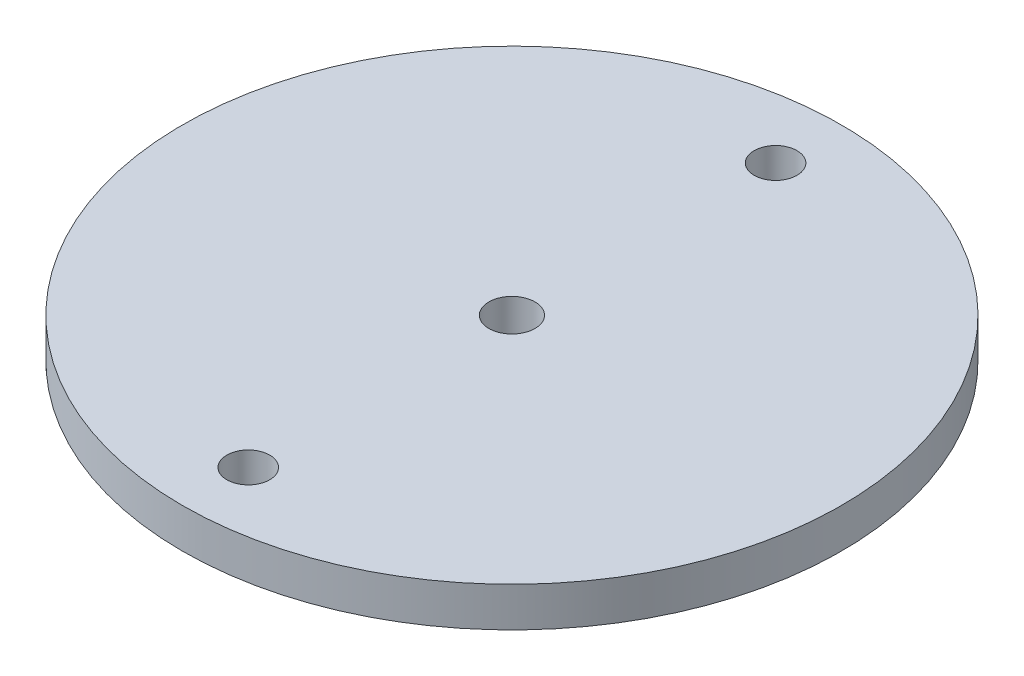
ISO-10303-21;
HEADER;
FILE_DESCRIPTION(('STEP AP214'),'2;1');
FILE_NAME('part.step','',(''),(''),'','','');
FILE_SCHEMA(('AUTOMOTIVE_DESIGN { 1 0 10303 214 1 1 1 1 }'));
ENDSEC;
DATA;
#1=APPLICATION_CONTEXT('core data for automotive mechanical design processes');
#2=APPLICATION_PROTOCOL_DEFINITION('international standard','automotive_design',2000,#1);
#3=PRODUCT_CONTEXT('',#1,'mechanical');
#4=PRODUCT('Part','Part','',(#3));
#5=PRODUCT_RELATED_PRODUCT_CATEGORY('part','',(#4));
#6=PRODUCT_DEFINITION_FORMATION('','',#4);
#7=PRODUCT_DEFINITION_CONTEXT('part definition',#1,'design');
#8=PRODUCT_DEFINITION('design','',#6,#7);
#9=PRODUCT_DEFINITION_SHAPE('','',#8);
#10=(LENGTH_UNIT() NAMED_UNIT(*) SI_UNIT(.MILLI.,.METRE.));
#11=(NAMED_UNIT(*) PLANE_ANGLE_UNIT() SI_UNIT($,.RADIAN.));
#12=(NAMED_UNIT(*) SI_UNIT($,.STERADIAN.) SOLID_ANGLE_UNIT());
#13=UNCERTAINTY_MEASURE_WITH_UNIT(LENGTH_MEASURE(1.E-05),#10,'distance_accuracy_value','');
#14=(GEOMETRIC_REPRESENTATION_CONTEXT(3) GLOBAL_UNCERTAINTY_ASSIGNED_CONTEXT((#13)) GLOBAL_UNIT_ASSIGNED_CONTEXT((#10,
#11,#12)) REPRESENTATION_CONTEXT('',''));
#15=CARTESIAN_POINT('',(0.,0.,0.));
#16=DIRECTION('',(0.,0.,1.));
#17=DIRECTION('',(1.,0.,0.));
#18=AXIS2_PLACEMENT_3D('',#15,#16,#17);
#19=CARTESIAN_POINT('',(-2.,-6.,2.06533895523229));
#20=DIRECTION('',(-1.,0.,0.));
#21=DIRECTION('',(0.,0.,1.));
#22=AXIS2_PLACEMENT_3D('',#19,#20,#21);
#23=PLANE('',#22);
#24=DIRECTION('',(0.,0.,-1.));
#25=VECTOR('',#24,1.);
#26=CARTESIAN_POINT('',(-2.,-10.,2.06533895523229));
#27=LINE('',#26,#25);
#28=CARTESIAN_POINT('',(-2.,-10.,2.06533895523229));
#29=VERTEX_POINT('',#28);
#30=CARTESIAN_POINT('',(-2.,-10.,-2.06533895523229));
#31=VERTEX_POINT('',#30);
#32=EDGE_CURVE('E112',#29,#31,#27,.T.);
#33=ORIENTED_EDGE('',*,*,#32,.T.);
#34=DIRECTION('',(0.,-1.,0.));
#35=VECTOR('',#34,1.);
#36=CARTESIAN_POINT('',(-2.,-6.,-2.06533895523229));
#37=LINE('',#36,#35);
#38=CARTESIAN_POINT('',(-2.,-6.,-2.06533895523229));
#39=VERTEX_POINT('',#38);
#40=EDGE_CURVE('E10',#39,#31,#37,.T.);
#41=ORIENTED_EDGE('',*,*,#40,.F.);
#42=DIRECTION('',(0.,0.,-1.));
#43=VECTOR('',#42,1.);
#44=CARTESIAN_POINT('',(-2.,-6.,2.06533895523229));
#45=LINE('',#44,#43);
#46=CARTESIAN_POINT('',(-2.,-6.,2.06533895523229));
#47=VERTEX_POINT('',#46);
#48=EDGE_CURVE('E85',#47,#39,#45,.T.);
#49=ORIENTED_EDGE('',*,*,#48,.F.);
#50=DIRECTION('',(0.,-1.,0.));
#51=VECTOR('',#50,1.);
#52=CARTESIAN_POINT('',(-2.,-6.,2.06533895523229));
#53=LINE('',#52,#51);
#54=EDGE_CURVE('E19',#47,#29,#53,.T.);
#55=ORIENTED_EDGE('',*,*,#54,.T.);
#56=EDGE_LOOP('',(#33,#41,#49,#55));
#57=FACE_BOUND('',#56,.T.);
#58=ADVANCED_FACE('F16',(#57),#23,.F.);
#59=CARTESIAN_POINT('',(2.,-6.,2.06533895523229));
#60=DIRECTION('',(1.,0.,0.));
#61=DIRECTION('',(0.,1.,0.));
#62=AXIS2_PLACEMENT_3D('',#59,#60,#61);
#63=PLANE('',#62);
#64=DIRECTION('',(0.,0.,1.));
#65=VECTOR('',#64,1.);
#66=CARTESIAN_POINT('',(2.,-10.,2.06533895523229));
#67=LINE('',#66,#65);
#68=CARTESIAN_POINT('',(2.,-10.,-2.06533895523229));
#69=VERTEX_POINT('',#68);
#70=CARTESIAN_POINT('',(2.,-10.,2.06533895523229));
#71=VERTEX_POINT('',#70);
#72=EDGE_CURVE('E111',#69,#71,#67,.T.);
#73=ORIENTED_EDGE('',*,*,#72,.T.);
#74=DIRECTION('',(0.,-1.,0.));
#75=VECTOR('',#74,1.);
#76=CARTESIAN_POINT('',(2.,-6.,2.06533895523229));
#77=LINE('',#76,#75);
#78=CARTESIAN_POINT('',(2.,-6.,2.06533895523229));
#79=VERTEX_POINT('',#78);
#80=EDGE_CURVE('E25',#79,#71,#77,.T.);
#81=ORIENTED_EDGE('',*,*,#80,.F.);
#82=DIRECTION('',(0.,0.,1.));
#83=VECTOR('',#82,1.);
#84=CARTESIAN_POINT('',(2.,-6.,2.06533895523229));
#85=LINE('',#84,#83);
#86=CARTESIAN_POINT('',(2.,-6.,-2.06533895523229));
#87=VERTEX_POINT('',#86);
#88=EDGE_CURVE('E77',#87,#79,#85,.T.);
#89=ORIENTED_EDGE('',*,*,#88,.F.);
#90=DIRECTION('',(0.,-1.,0.));
#91=VECTOR('',#90,1.);
#92=CARTESIAN_POINT('',(2.,-6.,-2.06533895523229));
#93=LINE('',#92,#91);
#94=EDGE_CURVE('E80',#87,#69,#93,.T.);
#95=ORIENTED_EDGE('',*,*,#94,.T.);
#96=EDGE_LOOP('',(#73,#81,#89,#95));
#97=FACE_BOUND('',#96,.T.);
#98=ADVANCED_FACE('F79',(#97),#63,.F.);
#99=CARTESIAN_POINT('',(0.,-6.,0.));
#100=DIRECTION('',(0.,-1.,0.));
#101=DIRECTION('',(0.,0.,-1.));
#102=AXIS2_PLACEMENT_3D('',#99,#100,#101);
#103=CYLINDRICAL_SURFACE('',#102,2.875);
#104=CARTESIAN_POINT('',(0.,-10.,0.));
#105=DIRECTION('',(0.,-1.,0.));
#106=DIRECTION('',(0.,0.,-1.));
#107=AXIS2_PLACEMENT_3D('',#104,#105,#106);
#108=CIRCLE('',#107,2.875);
#109=EDGE_CURVE('E108',#71,#29,#108,.T.);
#110=ORIENTED_EDGE('',*,*,#109,.T.);
#111=ORIENTED_EDGE('',*,*,#54,.F.);
#112=CARTESIAN_POINT('',(0.,-6.,0.));
#113=DIRECTION('',(0.,-1.,0.));
#114=DIRECTION('',(0.,0.,-1.));
#115=AXIS2_PLACEMENT_3D('',#112,#113,#114);
#116=CIRCLE('',#115,2.875);
#117=EDGE_CURVE('E137',#79,#47,#116,.T.);
#118=ORIENTED_EDGE('',*,*,#117,.F.);
#119=ORIENTED_EDGE('',*,*,#80,.T.);
#120=EDGE_LOOP('',(#110,#111,#118,#119));
#121=FACE_BOUND('',#120,.T.);
#122=ADVANCED_FACE('F197',(#121),#103,.F.);
#123=CARTESIAN_POINT('',(0.,-6.,0.));
#124=DIRECTION('',(0.,-1.,0.));
#125=DIRECTION('',(0.,0.,-1.));
#126=AXIS2_PLACEMENT_3D('',#123,#124,#125);
#127=PLANE('',#126);
#128=CARTESIAN_POINT('',(0.,-6.,0.));
#129=DIRECTION('',(0.,1.,0.));
#130=DIRECTION('',(0.,0.,-1.));
#131=AXIS2_PLACEMENT_3D('',#128,#129,#130);
#132=CIRCLE('',#131,1.75);
#133=CARTESIAN_POINT('',(0.,-6.,-1.75));
#134=VERTEX_POINT('',#133);
#135=EDGE_CURVE('E129',#134,#134,#132,.T.);
#136=ORIENTED_EDGE('',*,*,#135,.T.);
#137=EDGE_LOOP('',(#136));
#138=FACE_BOUND('',#137,.T.);
#139=ORIENTED_EDGE('',*,*,#117,.T.);
#140=ORIENTED_EDGE('',*,*,#48,.T.);
#141=CARTESIAN_POINT('',(0.,-6.,0.));
#142=DIRECTION('',(0.,-1.,0.));
#143=DIRECTION('',(0.,0.,-1.));
#144=AXIS2_PLACEMENT_3D('',#141,#142,#143);
#145=CIRCLE('',#144,2.875);
#146=EDGE_CURVE('E38',#39,#87,#145,.T.);
#147=ORIENTED_EDGE('',*,*,#146,.T.);
#148=ORIENTED_EDGE('',*,*,#88,.T.);
#149=EDGE_LOOP('',(#139,#140,#147,#148));
#150=FACE_BOUND('',#149,.T.);
#151=ADVANCED_FACE('F92',(#138,#150),#127,.T.);
#152=CARTESIAN_POINT('',(0.,0.,-25.));
#153=DIRECTION('',(0.,-1.,0.));
#154=DIRECTION('',(0.,0.,-1.));
#155=AXIS2_PLACEMENT_3D('',#152,#153,#154);
#156=PLANE('',#155);
#157=CARTESIAN_POINT('',(0.,0.,0.));
#158=DIRECTION('',(0.,-1.,0.));
#159=DIRECTION('',(0.,0.,-1.));
#160=AXIS2_PLACEMENT_3D('',#157,#158,#159);
#161=CIRCLE('',#160,1.75);
#162=CARTESIAN_POINT('',(0.,0.,-1.75));
#163=VERTEX_POINT('',#162);
#164=EDGE_CURVE('E125',#163,#163,#161,.T.);
#165=ORIENTED_EDGE('',*,*,#164,.T.);
#166=EDGE_LOOP('',(#165));
#167=FACE_BOUND('',#166,.T.);
#168=CARTESIAN_POINT('',(0.,0.,20.));
#169=DIRECTION('',(0.,1.,0.));
#170=DIRECTION('',(0.,0.,-1.));
#171=AXIS2_PLACEMENT_3D('',#168,#169,#170);
#172=CIRCLE('',#171,1.625);
#173=CARTESIAN_POINT('',(0.,0.,18.375));
#174=VERTEX_POINT('',#173);
#175=EDGE_CURVE('E102',#174,#174,#172,.T.);
#176=ORIENTED_EDGE('',*,*,#175,.F.);
#177=EDGE_LOOP('',(#176));
#178=FACE_BOUND('',#177,.T.);
#179=CARTESIAN_POINT('',(0.,0.,-20.));
#180=DIRECTION('',(0.,1.,0.));
#181=DIRECTION('',(0.,0.,-1.));
#182=AXIS2_PLACEMENT_3D('',#179,#180,#181);
#183=CIRCLE('',#182,1.625);
#184=CARTESIAN_POINT('',(0.,0.,-21.625));
#185=VERTEX_POINT('',#184);
#186=EDGE_CURVE('E155',#185,#185,#183,.T.);
#187=ORIENTED_EDGE('',*,*,#186,.F.);
#188=EDGE_LOOP('',(#187));
#189=FACE_BOUND('',#188,.T.);
#190=CARTESIAN_POINT('',(0.,0.,0.));
#191=DIRECTION('',(0.,1.,0.));
#192=DIRECTION('',(0.,0.,1.));
#193=AXIS2_PLACEMENT_3D('',#190,#191,#192);
#194=CIRCLE('',#193,25.);
#195=CARTESIAN_POINT('',(0.,0.,25.));
#196=VERTEX_POINT('',#195);
#197=EDGE_CURVE('E113',#196,#196,#194,.T.);
#198=ORIENTED_EDGE('',*,*,#197,.T.);
#199=EDGE_LOOP('',(#198));
#200=FACE_BOUND('',#199,.T.);
#201=ADVANCED_FACE('F164',(#167,#178,#189,#200),#156,.F.);
#202=CARTESIAN_POINT('',(0.,-3.,-5.));
#203=DIRECTION('',(0.,1.,0.));
#204=DIRECTION('',(1.,0.,0.));
#205=AXIS2_PLACEMENT_3D('',#202,#203,#204);
#206=PLANE('',#205);
#207=CARTESIAN_POINT('',(0.,-3.,0.));
#208=DIRECTION('',(0.,1.,0.));
#209=DIRECTION('',(0.,0.,1.));
#210=AXIS2_PLACEMENT_3D('',#207,#208,#209);
#211=CIRCLE('',#210,5.);
#212=CARTESIAN_POINT('',(0.,-3.,5.));
#213=VERTEX_POINT('',#212);
#214=EDGE_CURVE('E121',#213,#213,#211,.T.);
#215=ORIENTED_EDGE('',*,*,#214,.T.);
#216=EDGE_LOOP('',(#215));
#217=FACE_BOUND('',#216,.T.);
#218=CARTESIAN_POINT('',(0.,-3.,20.));
#219=DIRECTION('',(0.,-1.,0.));
#220=DIRECTION('',(0.,0.,-1.));
#221=AXIS2_PLACEMENT_3D('',#218,#219,#220);
#222=CIRCLE('',#221,1.625);
#223=CARTESIAN_POINT('',(0.,-3.,18.375));
#224=VERTEX_POINT('',#223);
#225=EDGE_CURVE('E94',#224,#224,#222,.T.);
#226=ORIENTED_EDGE('',*,*,#225,.F.);
#227=EDGE_LOOP('',(#226));
#228=FACE_BOUND('',#227,.T.);
#229=CARTESIAN_POINT('',(0.,-3.,-20.));
#230=DIRECTION('',(0.,-1.,0.));
#231=DIRECTION('',(0.,0.,1.));
#232=AXIS2_PLACEMENT_3D('',#229,#230,#231);
#233=CIRCLE('',#232,1.625);
#234=CARTESIAN_POINT('',(0.,-3.,-18.375));
#235=VERTEX_POINT('',#234);
#236=EDGE_CURVE('E151',#235,#235,#233,.T.);
#237=ORIENTED_EDGE('',*,*,#236,.F.);
#238=EDGE_LOOP('',(#237));
#239=FACE_BOUND('',#238,.T.);
#240=CARTESIAN_POINT('',(0.,-3.,0.));
#241=DIRECTION('',(0.,1.,0.));
#242=DIRECTION('',(0.,0.,1.));
#243=AXIS2_PLACEMENT_3D('',#240,#241,#242);
#244=CIRCLE('',#243,25.);
#245=CARTESIAN_POINT('',(0.,-3.,25.));
#246=VERTEX_POINT('',#245);
#247=EDGE_CURVE('E89',#246,#246,#244,.T.);
#248=ORIENTED_EDGE('',*,*,#247,.F.);
#249=EDGE_LOOP('',(#248));
#250=FACE_BOUND('',#249,.T.);
#251=ADVANCED_FACE('F167',(#217,#228,#239,#250),#206,.F.);
#252=CARTESIAN_POINT('',(0.,-10.,0.));
#253=DIRECTION('',(0.,1.,0.));
#254=DIRECTION('',(1.,0.,0.));
#255=AXIS2_PLACEMENT_3D('',#252,#253,#254);
#256=PLANE('',#255);
#257=ORIENTED_EDGE('',*,*,#32,.F.);
#258=ORIENTED_EDGE('',*,*,#109,.F.);
#259=ORIENTED_EDGE('',*,*,#72,.F.);
#260=CARTESIAN_POINT('',(0.,-10.,0.));
#261=DIRECTION('',(0.,-1.,0.));
#262=DIRECTION('',(0.,0.,-1.));
#263=AXIS2_PLACEMENT_3D('',#260,#261,#262);
#264=CIRCLE('',#263,2.875);
#265=EDGE_CURVE('E87',#31,#69,#264,.T.);
#266=ORIENTED_EDGE('',*,*,#265,.F.);
#267=EDGE_LOOP('',(#257,#258,#259,#266));
#268=FACE_BOUND('',#267,.T.);
#269=CARTESIAN_POINT('',(0.,-10.,0.));
#270=DIRECTION('',(0.,1.,0.));
#271=DIRECTION('',(0.,0.,1.));
#272=AXIS2_PLACEMENT_3D('',#269,#270,#271);
#273=CIRCLE('',#272,5.);
#274=CARTESIAN_POINT('',(0.,-10.,5.));
#275=VERTEX_POINT('',#274);
#276=EDGE_CURVE('E117',#275,#275,#273,.T.);
#277=ORIENTED_EDGE('',*,*,#276,.F.);
#278=EDGE_LOOP('',(#277));
#279=FACE_BOUND('',#278,.T.);
#280=ADVANCED_FACE('F180',(#268,#279),#256,.F.);
#281=CARTESIAN_POINT('',(0.,0.,0.));
#282=DIRECTION('',(0.,-1.,0.));
#283=DIRECTION('',(0.,0.,-1.));
#284=AXIS2_PLACEMENT_3D('',#281,#282,#283);
#285=CYLINDRICAL_SURFACE('',#284,1.75);
#286=ORIENTED_EDGE('',*,*,#135,.F.);
#287=EDGE_LOOP('',(#286));
#288=FACE_BOUND('',#287,.T.);
#289=ORIENTED_EDGE('',*,*,#164,.F.);
#290=EDGE_LOOP('',(#289));
#291=FACE_BOUND('',#290,.T.);
#292=ADVANCED_FACE('F187',(#288,#291),#285,.F.);
#293=CARTESIAN_POINT('',(0.,0.,0.));
#294=DIRECTION('',(0.,1.,0.));
#295=DIRECTION('',(0.,0.,1.));
#296=AXIS2_PLACEMENT_3D('',#293,#294,#295);
#297=CYLINDRICAL_SURFACE('',#296,5.);
#298=ORIENTED_EDGE('',*,*,#214,.F.);
#299=EDGE_LOOP('',(#298));
#300=FACE_BOUND('',#299,.T.);
#301=ORIENTED_EDGE('',*,*,#276,.T.);
#302=EDGE_LOOP('',(#301));
#303=FACE_BOUND('',#302,.T.);
#304=ADVANCED_FACE('F175',(#300,#303),#297,.T.);
#305=CARTESIAN_POINT('',(0.,0.,0.));
#306=DIRECTION('',(0.,1.,0.));
#307=DIRECTION('',(0.,0.,1.));
#308=AXIS2_PLACEMENT_3D('',#305,#306,#307);
#309=CYLINDRICAL_SURFACE('',#308,25.);
#310=ORIENTED_EDGE('',*,*,#197,.F.);
#311=EDGE_LOOP('',(#310));
#312=FACE_BOUND('',#311,.T.);
#313=ORIENTED_EDGE('',*,*,#247,.T.);
#314=EDGE_LOOP('',(#313));
#315=FACE_BOUND('',#314,.T.);
#316=ADVANCED_FACE('F172',(#312,#315),#309,.T.);
#317=CARTESIAN_POINT('',(0.,-6.,0.));
#318=DIRECTION('',(0.,-1.,0.));
#319=DIRECTION('',(0.,0.,-1.));
#320=AXIS2_PLACEMENT_3D('',#317,#318,#319);
#321=CYLINDRICAL_SURFACE('',#320,2.875);
#322=ORIENTED_EDGE('',*,*,#146,.F.);
#323=ORIENTED_EDGE('',*,*,#40,.T.);
#324=ORIENTED_EDGE('',*,*,#265,.T.);
#325=ORIENTED_EDGE('',*,*,#94,.F.);
#326=EDGE_LOOP('',(#322,#323,#324,#325));
#327=FACE_BOUND('',#326,.T.);
#328=ADVANCED_FACE('F86',(#327),#321,.F.);
#329=CARTESIAN_POINT('',(0.,0.00100000000000013,20.));
#330=DIRECTION('',(0.,-1.,0.));
#331=DIRECTION('',(0.,0.,-1.));
#332=AXIS2_PLACEMENT_3D('',#329,#330,#331);
#333=CYLINDRICAL_SURFACE('',#332,1.625);
#334=ORIENTED_EDGE('',*,*,#225,.T.);
#335=EDGE_LOOP('',(#334));
#336=FACE_BOUND('',#335,.T.);
#337=ORIENTED_EDGE('',*,*,#175,.T.);
#338=EDGE_LOOP('',(#337));
#339=FACE_BOUND('',#338,.T.);
#340=ADVANCED_FACE('F335',(#336,#339),#333,.F.);
#341=CARTESIAN_POINT('',(0.,0.00100000000000013,-20.));
#342=DIRECTION('',(0.,-1.,0.));
#343=DIRECTION('',(0.,0.,-1.));
#344=AXIS2_PLACEMENT_3D('',#341,#342,#343);
#345=CYLINDRICAL_SURFACE('',#344,1.625);
#346=ORIENTED_EDGE('',*,*,#236,.T.);
#347=EDGE_LOOP('',(#346));
#348=FACE_BOUND('',#347,.T.);
#349=ORIENTED_EDGE('',*,*,#186,.T.);
#350=EDGE_LOOP('',(#349));
#351=FACE_BOUND('',#350,.T.);
#352=ADVANCED_FACE('F162',(#348,#351),#345,.F.);
#353=CLOSED_SHELL('',(#58,#98,#122,#151,#201,#251,#280,#292,#304,#316,#328,#340,#352));
#354=MANIFOLD_SOLID_BREP('B1',#353);
#355=ADVANCED_BREP_SHAPE_REPRESENTATION('',(#18,#354),#14);
#356=SHAPE_DEFINITION_REPRESENTATION(#9,#355);
ENDSEC;
END-ISO-10303-21;
